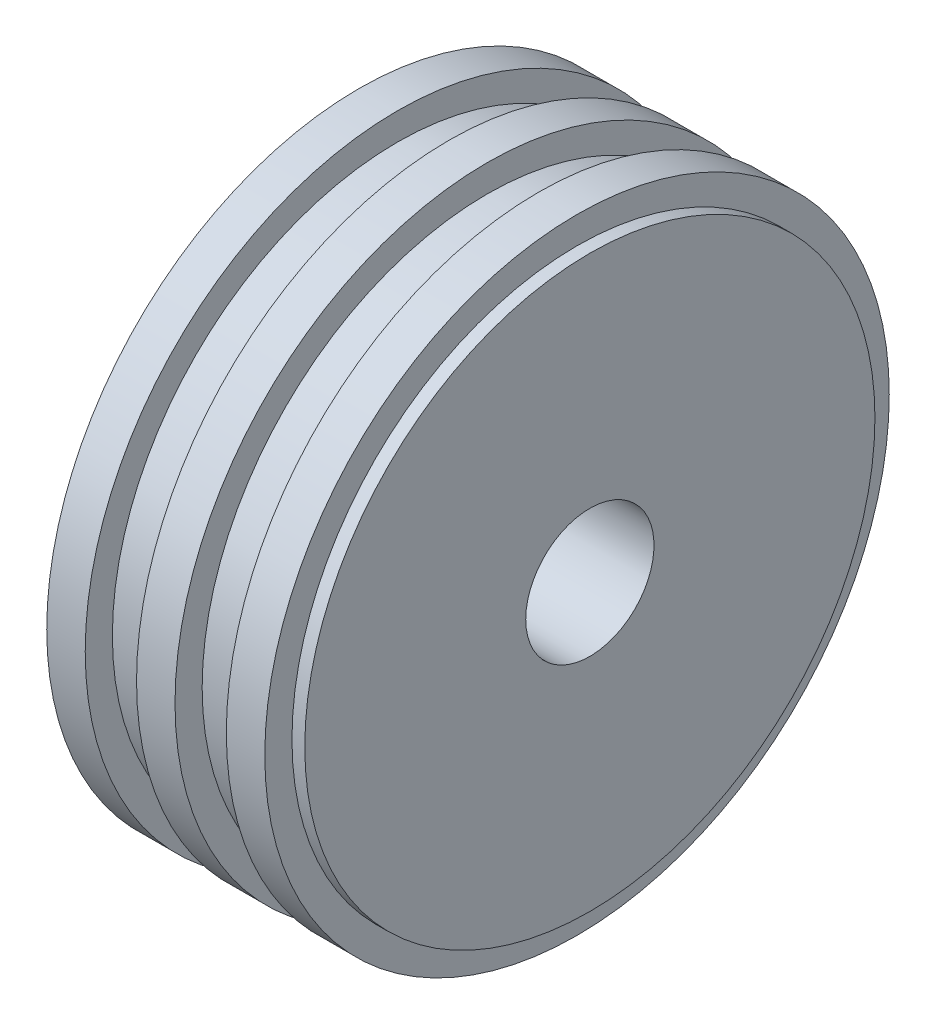
ISO-10303-21;
HEADER;
FILE_DESCRIPTION(('STEP AP214'),'2;1');
FILE_NAME('part.step','',(''),(''),'','','');
FILE_SCHEMA(('AUTOMOTIVE_DESIGN { 1 0 10303 214 1 1 1 1 }'));
ENDSEC;
DATA;
#1=APPLICATION_CONTEXT('core data for automotive mechanical design processes');
#2=APPLICATION_PROTOCOL_DEFINITION('international standard','automotive_design',2000,#1);
#3=PRODUCT_CONTEXT('',#1,'mechanical');
#4=PRODUCT('Part','Part','',(#3));
#5=PRODUCT_RELATED_PRODUCT_CATEGORY('part','',(#4));
#6=PRODUCT_DEFINITION_FORMATION('','',#4);
#7=PRODUCT_DEFINITION_CONTEXT('part definition',#1,'design');
#8=PRODUCT_DEFINITION('design','',#6,#7);
#9=PRODUCT_DEFINITION_SHAPE('','',#8);
#10=(LENGTH_UNIT() NAMED_UNIT(*) SI_UNIT(.MILLI.,.METRE.));
#11=(NAMED_UNIT(*) PLANE_ANGLE_UNIT() SI_UNIT($,.RADIAN.));
#12=(NAMED_UNIT(*) SI_UNIT($,.STERADIAN.) SOLID_ANGLE_UNIT());
#13=UNCERTAINTY_MEASURE_WITH_UNIT(LENGTH_MEASURE(1.E-05),#10,'distance_accuracy_value','');
#14=(GEOMETRIC_REPRESENTATION_CONTEXT(3) GLOBAL_UNCERTAINTY_ASSIGNED_CONTEXT((#13)) GLOBAL_UNIT_ASSIGNED_CONTEXT((#10,
#11,#12)) REPRESENTATION_CONTEXT('',''));
#15=CARTESIAN_POINT('',(0.,0.,0.));
#16=DIRECTION('',(0.,0.,1.));
#17=DIRECTION('',(1.,0.,0.));
#18=AXIS2_PLACEMENT_3D('',#15,#16,#17);
#19=CARTESIAN_POINT('',(-28.5,0.,0.));
#20=DIRECTION('',(1.,0.,0.));
#21=DIRECTION('',(0.,0.,-1.));
#22=AXIS2_PLACEMENT_3D('',#19,#20,#21);
#23=PLANE('',#22);
#24=CARTESIAN_POINT('',(-28.5,0.,0.));
#25=DIRECTION('',(-1.,0.,0.));
#26=DIRECTION('',(0.,0.,1.));
#27=AXIS2_PLACEMENT_3D('',#24,#25,#26);
#28=CIRCLE('',#27,15.);
#29=CARTESIAN_POINT('',(-28.5,0.,15.));
#30=VERTEX_POINT('',#29);
#31=EDGE_CURVE('E91',#30,#30,#28,.T.);
#32=ORIENTED_EDGE('',*,*,#31,.F.);
#33=EDGE_LOOP('',(#32));
#34=FACE_BOUND('',#33,.T.);
#35=CARTESIAN_POINT('',(-28.5,0.,0.));
#36=DIRECTION('',(-1.,0.,0.));
#37=DIRECTION('',(0.,0.,1.));
#38=AXIS2_PLACEMENT_3D('',#35,#36,#37);
#39=CIRCLE('',#38,66.675);
#40=CARTESIAN_POINT('',(-28.5,0.,66.675));
#41=VERTEX_POINT('',#40);
#42=EDGE_CURVE('E10',#41,#41,#39,.T.);
#43=ORIENTED_EDGE('',*,*,#42,.T.);
#44=EDGE_LOOP('',(#43));
#45=FACE_BOUND('',#44,.T.);
#46=ADVANCED_FACE('F41',(#34,#45),#23,.F.);
#47=CARTESIAN_POINT('',(0.,0.,0.));
#48=DIRECTION('',(-1.,0.,0.));
#49=DIRECTION('',(0.,0.,1.));
#50=AXIS2_PLACEMENT_3D('',#47,#48,#49);
#51=CYLINDRICAL_SURFACE('',#50,66.675);
#52=ORIENTED_EDGE('',*,*,#42,.F.);
#53=EDGE_LOOP('',(#52));
#54=FACE_BOUND('',#53,.T.);
#55=CARTESIAN_POINT('',(-25.5,0.,0.));
#56=DIRECTION('',(-1.,0.,0.));
#57=DIRECTION('',(0.,0.,1.));
#58=AXIS2_PLACEMENT_3D('',#55,#56,#57);
#59=CIRCLE('',#58,66.675);
#60=CARTESIAN_POINT('',(-25.5,0.,66.675));
#61=VERTEX_POINT('',#60);
#62=EDGE_CURVE('E47',#61,#61,#59,.T.);
#63=ORIENTED_EDGE('',*,*,#62,.T.);
#64=EDGE_LOOP('',(#63));
#65=FACE_BOUND('',#64,.T.);
#66=ADVANCED_FACE('F107',(#54,#65),#51,.T.);
#67=CARTESIAN_POINT('',(-25.5,66.675,0.));
#68=DIRECTION('',(1.,0.,0.));
#69=DIRECTION('',(0.,0.,-1.));
#70=AXIS2_PLACEMENT_3D('',#67,#68,#69);
#71=PLANE('',#70);
#72=ORIENTED_EDGE('',*,*,#62,.F.);
#73=EDGE_LOOP('',(#72));
#74=FACE_BOUND('',#73,.T.);
#75=CARTESIAN_POINT('',(-25.5,0.,0.));
#76=DIRECTION('',(-1.,0.,0.));
#77=DIRECTION('',(0.,0.,1.));
#78=AXIS2_PLACEMENT_3D('',#75,#76,#77);
#79=CIRCLE('',#78,73.025);
#80=CARTESIAN_POINT('',(-25.5,0.,73.025));
#81=VERTEX_POINT('',#80);
#82=EDGE_CURVE('E51',#81,#81,#79,.T.);
#83=ORIENTED_EDGE('',*,*,#82,.T.);
#84=EDGE_LOOP('',(#83));
#85=FACE_BOUND('',#84,.T.);
#86=ADVANCED_FACE('F113',(#74,#85),#71,.F.);
#87=CARTESIAN_POINT('',(0.,0.,0.));
#88=DIRECTION('',(-1.,0.,0.));
#89=DIRECTION('',(0.,0.,1.));
#90=AXIS2_PLACEMENT_3D('',#87,#88,#89);
#91=CYLINDRICAL_SURFACE('',#90,73.025);
#92=ORIENTED_EDGE('',*,*,#82,.F.);
#93=EDGE_LOOP('',(#92));
#94=FACE_BOUND('',#93,.T.);
#95=CARTESIAN_POINT('',(-16.5,0.,0.));
#96=DIRECTION('',(-1.,0.,0.));
#97=DIRECTION('',(0.,0.,1.));
#98=AXIS2_PLACEMENT_3D('',#95,#96,#97);
#99=CIRCLE('',#98,73.025);
#100=CARTESIAN_POINT('',(-16.5,0.,73.025));
#101=VERTEX_POINT('',#100);
#102=EDGE_CURVE('E55',#101,#101,#99,.T.);
#103=ORIENTED_EDGE('',*,*,#102,.T.);
#104=EDGE_LOOP('',(#103));
#105=FACE_BOUND('',#104,.T.);
#106=ADVANCED_FACE('F118',(#94,#105),#91,.T.);
#107=CARTESIAN_POINT('',(-16.5,73.025,0.));
#108=DIRECTION('',(-1.,0.,0.));
#109=DIRECTION('',(0.,0.,1.));
#110=AXIS2_PLACEMENT_3D('',#107,#108,#109);
#111=PLANE('',#110);
#112=ORIENTED_EDGE('',*,*,#102,.F.);
#113=EDGE_LOOP('',(#112));
#114=FACE_BOUND('',#113,.T.);
#115=CARTESIAN_POINT('',(-16.5,0.,0.));
#116=DIRECTION('',(-1.,0.,0.));
#117=DIRECTION('',(0.,0.,1.));
#118=AXIS2_PLACEMENT_3D('',#115,#116,#117);
#119=CIRCLE('',#118,66.675);
#120=CARTESIAN_POINT('',(-16.5,0.,66.675));
#121=VERTEX_POINT('',#120);
#122=EDGE_CURVE('E60',#121,#121,#119,.T.);
#123=ORIENTED_EDGE('',*,*,#122,.T.);
#124=EDGE_LOOP('',(#123));
#125=FACE_BOUND('',#124,.T.);
#126=ADVANCED_FACE('F124',(#114,#125),#111,.F.);
#127=CARTESIAN_POINT('',(0.,0.,0.));
#128=DIRECTION('',(-1.,0.,0.));
#129=DIRECTION('',(0.,0.,1.));
#130=AXIS2_PLACEMENT_3D('',#127,#128,#129);
#131=CYLINDRICAL_SURFACE('',#130,66.675);
#132=ORIENTED_EDGE('',*,*,#122,.F.);
#133=EDGE_LOOP('',(#132));
#134=FACE_BOUND('',#133,.T.);
#135=CARTESIAN_POINT('',(-4.50000000000001,0.,0.));
#136=DIRECTION('',(-1.,0.,0.));
#137=DIRECTION('',(0.,0.,1.));
#138=AXIS2_PLACEMENT_3D('',#135,#136,#137);
#139=CIRCLE('',#138,66.675);
#140=CARTESIAN_POINT('',(-4.50000000000001,0.,66.675));
#141=VERTEX_POINT('',#140);
#142=EDGE_CURVE('E63',#141,#141,#139,.T.);
#143=ORIENTED_EDGE('',*,*,#142,.T.);
#144=EDGE_LOOP('',(#143));
#145=FACE_BOUND('',#144,.T.);
#146=ADVANCED_FACE('F128',(#134,#145),#131,.T.);
#147=CARTESIAN_POINT('',(-4.50000000000001,66.675,0.));
#148=DIRECTION('',(1.,0.,0.));
#149=DIRECTION('',(0.,0.,-1.));
#150=AXIS2_PLACEMENT_3D('',#147,#148,#149);
#151=PLANE('',#150);
#152=ORIENTED_EDGE('',*,*,#142,.F.);
#153=EDGE_LOOP('',(#152));
#154=FACE_BOUND('',#153,.T.);
#155=CARTESIAN_POINT('',(-4.50000000000001,0.,0.));
#156=DIRECTION('',(-1.,0.,0.));
#157=DIRECTION('',(0.,0.,1.));
#158=AXIS2_PLACEMENT_3D('',#155,#156,#157);
#159=CIRCLE('',#158,73.025);
#160=CARTESIAN_POINT('',(-4.50000000000001,0.,73.025));
#161=VERTEX_POINT('',#160);
#162=EDGE_CURVE('E66',#161,#161,#159,.T.);
#163=ORIENTED_EDGE('',*,*,#162,.T.);
#164=EDGE_LOOP('',(#163));
#165=FACE_BOUND('',#164,.T.);
#166=ADVANCED_FACE('F132',(#154,#165),#151,.F.);
#167=CARTESIAN_POINT('',(0.,0.,0.));
#168=DIRECTION('',(-1.,0.,0.));
#169=DIRECTION('',(0.,0.,1.));
#170=AXIS2_PLACEMENT_3D('',#167,#168,#169);
#171=CYLINDRICAL_SURFACE('',#170,73.025);
#172=ORIENTED_EDGE('',*,*,#162,.F.);
#173=EDGE_LOOP('',(#172));
#174=FACE_BOUND('',#173,.T.);
#175=CARTESIAN_POINT('',(4.49999999999999,0.,0.));
#176=DIRECTION('',(-1.,0.,0.));
#177=DIRECTION('',(0.,0.,1.));
#178=AXIS2_PLACEMENT_3D('',#175,#176,#177);
#179=CIRCLE('',#178,73.025);
#180=CARTESIAN_POINT('',(4.49999999999999,0.,73.025));
#181=VERTEX_POINT('',#180);
#182=EDGE_CURVE('E69',#181,#181,#179,.T.);
#183=ORIENTED_EDGE('',*,*,#182,.T.);
#184=EDGE_LOOP('',(#183));
#185=FACE_BOUND('',#184,.T.);
#186=ADVANCED_FACE('F136',(#174,#185),#171,.T.);
#187=CARTESIAN_POINT('',(4.49999999999999,73.025,0.));
#188=DIRECTION('',(-1.,0.,0.));
#189=DIRECTION('',(0.,0.,1.));
#190=AXIS2_PLACEMENT_3D('',#187,#188,#189);
#191=PLANE('',#190);
#192=ORIENTED_EDGE('',*,*,#182,.F.);
#193=EDGE_LOOP('',(#192));
#194=FACE_BOUND('',#193,.T.);
#195=CARTESIAN_POINT('',(4.49999999999999,0.,0.));
#196=DIRECTION('',(-1.,0.,0.));
#197=DIRECTION('',(0.,0.,1.));
#198=AXIS2_PLACEMENT_3D('',#195,#196,#197);
#199=CIRCLE('',#198,66.675);
#200=CARTESIAN_POINT('',(4.49999999999999,0.,66.675));
#201=VERTEX_POINT('',#200);
#202=EDGE_CURVE('E72',#201,#201,#199,.T.);
#203=ORIENTED_EDGE('',*,*,#202,.T.);
#204=EDGE_LOOP('',(#203));
#205=FACE_BOUND('',#204,.T.);
#206=ADVANCED_FACE('F140',(#194,#205),#191,.F.);
#207=CARTESIAN_POINT('',(0.,0.,0.));
#208=DIRECTION('',(-1.,0.,0.));
#209=DIRECTION('',(0.,0.,1.));
#210=AXIS2_PLACEMENT_3D('',#207,#208,#209);
#211=CYLINDRICAL_SURFACE('',#210,66.675);
#212=ORIENTED_EDGE('',*,*,#202,.F.);
#213=EDGE_LOOP('',(#212));
#214=FACE_BOUND('',#213,.T.);
#215=CARTESIAN_POINT('',(16.5,0.,0.));
#216=DIRECTION('',(-1.,0.,0.));
#217=DIRECTION('',(0.,0.,1.));
#218=AXIS2_PLACEMENT_3D('',#215,#216,#217);
#219=CIRCLE('',#218,66.675);
#220=CARTESIAN_POINT('',(16.5,0.,66.675));
#221=VERTEX_POINT('',#220);
#222=EDGE_CURVE('E75',#221,#221,#219,.T.);
#223=ORIENTED_EDGE('',*,*,#222,.T.);
#224=EDGE_LOOP('',(#223));
#225=FACE_BOUND('',#224,.T.);
#226=ADVANCED_FACE('F144',(#214,#225),#211,.T.);
#227=CARTESIAN_POINT('',(16.5,66.675,0.));
#228=DIRECTION('',(1.,0.,0.));
#229=DIRECTION('',(0.,0.,-1.));
#230=AXIS2_PLACEMENT_3D('',#227,#228,#229);
#231=PLANE('',#230);
#232=ORIENTED_EDGE('',*,*,#222,.F.);
#233=EDGE_LOOP('',(#232));
#234=FACE_BOUND('',#233,.T.);
#235=CARTESIAN_POINT('',(16.5,0.,0.));
#236=DIRECTION('',(-1.,0.,0.));
#237=DIRECTION('',(0.,0.,1.));
#238=AXIS2_PLACEMENT_3D('',#235,#236,#237);
#239=CIRCLE('',#238,73.025);
#240=CARTESIAN_POINT('',(16.5,0.,73.025));
#241=VERTEX_POINT('',#240);
#242=EDGE_CURVE('E78',#241,#241,#239,.T.);
#243=ORIENTED_EDGE('',*,*,#242,.T.);
#244=EDGE_LOOP('',(#243));
#245=FACE_BOUND('',#244,.T.);
#246=ADVANCED_FACE('F148',(#234,#245),#231,.F.);
#247=CARTESIAN_POINT('',(0.,0.,0.));
#248=DIRECTION('',(-1.,0.,0.));
#249=DIRECTION('',(0.,0.,1.));
#250=AXIS2_PLACEMENT_3D('',#247,#248,#249);
#251=CYLINDRICAL_SURFACE('',#250,73.025);
#252=ORIENTED_EDGE('',*,*,#242,.F.);
#253=EDGE_LOOP('',(#252));
#254=FACE_BOUND('',#253,.T.);
#255=CARTESIAN_POINT('',(25.5,0.,0.));
#256=DIRECTION('',(-1.,0.,0.));
#257=DIRECTION('',(0.,0.,1.));
#258=AXIS2_PLACEMENT_3D('',#255,#256,#257);
#259=CIRCLE('',#258,73.025);
#260=CARTESIAN_POINT('',(25.5,0.,73.025));
#261=VERTEX_POINT('',#260);
#262=EDGE_CURVE('E81',#261,#261,#259,.T.);
#263=ORIENTED_EDGE('',*,*,#262,.T.);
#264=EDGE_LOOP('',(#263));
#265=FACE_BOUND('',#264,.T.);
#266=ADVANCED_FACE('F152',(#254,#265),#251,.T.);
#267=CARTESIAN_POINT('',(25.5,73.025,0.));
#268=DIRECTION('',(-1.,0.,0.));
#269=DIRECTION('',(0.,0.,1.));
#270=AXIS2_PLACEMENT_3D('',#267,#268,#269);
#271=PLANE('',#270);
#272=ORIENTED_EDGE('',*,*,#262,.F.);
#273=EDGE_LOOP('',(#272));
#274=FACE_BOUND('',#273,.T.);
#275=CARTESIAN_POINT('',(25.5,0.,0.));
#276=DIRECTION('',(-1.,0.,0.));
#277=DIRECTION('',(0.,0.,1.));
#278=AXIS2_PLACEMENT_3D('',#275,#276,#277);
#279=CIRCLE('',#278,66.675);
#280=CARTESIAN_POINT('',(25.5,0.,66.675));
#281=VERTEX_POINT('',#280);
#282=EDGE_CURVE('E84',#281,#281,#279,.T.);
#283=ORIENTED_EDGE('',*,*,#282,.T.);
#284=EDGE_LOOP('',(#283));
#285=FACE_BOUND('',#284,.T.);
#286=ADVANCED_FACE('F156',(#274,#285),#271,.F.);
#287=CARTESIAN_POINT('',(0.,0.,0.));
#288=DIRECTION('',(-1.,0.,0.));
#289=DIRECTION('',(0.,0.,1.));
#290=AXIS2_PLACEMENT_3D('',#287,#288,#289);
#291=CYLINDRICAL_SURFACE('',#290,66.675);
#292=ORIENTED_EDGE('',*,*,#282,.F.);
#293=EDGE_LOOP('',(#292));
#294=FACE_BOUND('',#293,.T.);
#295=CARTESIAN_POINT('',(28.5,0.,0.));
#296=DIRECTION('',(-1.,0.,0.));
#297=DIRECTION('',(0.,0.,1.));
#298=AXIS2_PLACEMENT_3D('',#295,#296,#297);
#299=CIRCLE('',#298,66.675);
#300=CARTESIAN_POINT('',(28.5,0.,66.675));
#301=VERTEX_POINT('',#300);
#302=EDGE_CURVE('E87',#301,#301,#299,.T.);
#303=ORIENTED_EDGE('',*,*,#302,.T.);
#304=EDGE_LOOP('',(#303));
#305=FACE_BOUND('',#304,.T.);
#306=ADVANCED_FACE('F160',(#294,#305),#291,.T.);
#307=CARTESIAN_POINT('',(28.5,66.675,0.));
#308=DIRECTION('',(-1.,0.,0.));
#309=DIRECTION('',(0.,0.,1.));
#310=AXIS2_PLACEMENT_3D('',#307,#308,#309);
#311=PLANE('',#310);
#312=CARTESIAN_POINT('',(28.5,0.,0.));
#313=DIRECTION('',(-1.,0.,0.));
#314=DIRECTION('',(0.,0.,1.));
#315=AXIS2_PLACEMENT_3D('',#312,#313,#314);
#316=CIRCLE('',#315,15.);
#317=CARTESIAN_POINT('',(28.5,0.,15.));
#318=VERTEX_POINT('',#317);
#319=EDGE_CURVE('E90',#318,#318,#316,.T.);
#320=ORIENTED_EDGE('',*,*,#319,.T.);
#321=EDGE_LOOP('',(#320));
#322=FACE_BOUND('',#321,.T.);
#323=ORIENTED_EDGE('',*,*,#302,.F.);
#324=EDGE_LOOP('',(#323));
#325=FACE_BOUND('',#324,.T.);
#326=ADVANCED_FACE('F97',(#322,#325),#311,.F.);
#327=CARTESIAN_POINT('',(28.5,0.,0.));
#328=DIRECTION('',(-1.,0.,0.));
#329=DIRECTION('',(0.,0.,1.));
#330=AXIS2_PLACEMENT_3D('',#327,#328,#329);
#331=CYLINDRICAL_SURFACE('',#330,15.);
#332=ORIENTED_EDGE('',*,*,#319,.F.);
#333=EDGE_LOOP('',(#332));
#334=FACE_BOUND('',#333,.T.);
#335=ORIENTED_EDGE('',*,*,#31,.T.);
#336=EDGE_LOOP('',(#335));
#337=FACE_BOUND('',#336,.T.);
#338=ADVANCED_FACE('F100',(#334,#337),#331,.F.);
#339=CLOSED_SHELL('',(#46,#66,#86,#106,#126,#146,#166,#186,#206,#226,#246,#266,#286,#306,#326,#338));
#340=MANIFOLD_SOLID_BREP('B2',#339);
#341=ADVANCED_BREP_SHAPE_REPRESENTATION('',(#18,#340),#14);
#342=SHAPE_DEFINITION_REPRESENTATION(#9,#341);
ENDSEC;
END-ISO-10303-21;
